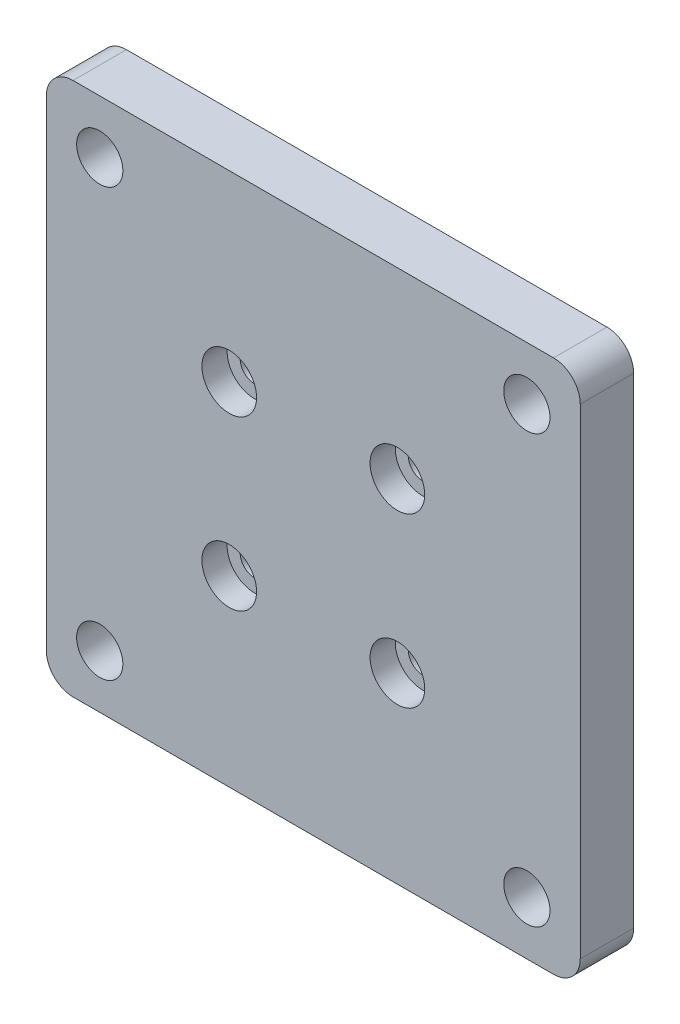
ISO-10303-21;
HEADER;
FILE_DESCRIPTION(('STEP AP214'),'2;1');
FILE_NAME('part.step','',(''),(''),'','','');
FILE_SCHEMA(('AUTOMOTIVE_DESIGN { 1 0 10303 214 1 1 1 1 }'));
ENDSEC;
DATA;
#1=APPLICATION_CONTEXT('core data for automotive mechanical design processes');
#2=APPLICATION_PROTOCOL_DEFINITION('international standard','automotive_design',2000,#1);
#3=PRODUCT_CONTEXT('',#1,'mechanical');
#4=PRODUCT('Part','Part','',(#3));
#5=PRODUCT_RELATED_PRODUCT_CATEGORY('part','',(#4));
#6=PRODUCT_DEFINITION_FORMATION('','',#4);
#7=PRODUCT_DEFINITION_CONTEXT('part definition',#1,'design');
#8=PRODUCT_DEFINITION('design','',#6,#7);
#9=PRODUCT_DEFINITION_SHAPE('','',#8);
#10=(LENGTH_UNIT() NAMED_UNIT(*) SI_UNIT(.MILLI.,.METRE.));
#11=(NAMED_UNIT(*) PLANE_ANGLE_UNIT() SI_UNIT($,.RADIAN.));
#12=(NAMED_UNIT(*) SI_UNIT($,.STERADIAN.) SOLID_ANGLE_UNIT());
#13=UNCERTAINTY_MEASURE_WITH_UNIT(LENGTH_MEASURE(1.E-05),#10,'distance_accuracy_value','');
#14=(GEOMETRIC_REPRESENTATION_CONTEXT(3) GLOBAL_UNCERTAINTY_ASSIGNED_CONTEXT((#13)) GLOBAL_UNIT_ASSIGNED_CONTEXT((#10,
#11,#12)) REPRESENTATION_CONTEXT('',''));
#15=CARTESIAN_POINT('',(0.,0.,0.));
#16=DIRECTION('',(0.,0.,1.));
#17=DIRECTION('',(1.,0.,0.));
#18=AXIS2_PLACEMENT_3D('',#15,#16,#17);
#19=CARTESIAN_POINT('',(-31.75,-31.75,3.175));
#20=DIRECTION('',(1.,0.,0.));
#21=DIRECTION('',(0.,0.,-1.));
#22=AXIS2_PLACEMENT_3D('',#19,#20,#21);
#23=PLANE('',#22);
#24=DIRECTION('',(0.,-1.,0.));
#25=VECTOR('',#24,1.);
#26=CARTESIAN_POINT('',(-31.75,-31.75,-3.175));
#27=LINE('',#26,#25);
#28=CARTESIAN_POINT('',(-31.75,28.575,-3.175));
#29=VERTEX_POINT('',#28);
#30=CARTESIAN_POINT('',(-31.75,-28.575,-3.175));
#31=VERTEX_POINT('',#30);
#32=EDGE_CURVE('E142',#29,#31,#27,.T.);
#33=ORIENTED_EDGE('',*,*,#32,.T.);
#34=DIRECTION('',(0.,0.,-1.));
#35=VECTOR('',#34,1.);
#36=CARTESIAN_POINT('',(-31.75,-28.575,3.175));
#37=LINE('',#36,#35);
#38=CARTESIAN_POINT('',(-31.75,-28.575,3.175));
#39=VERTEX_POINT('',#38);
#40=EDGE_CURVE('E165',#31,#39,#37,.F.);
#41=ORIENTED_EDGE('',*,*,#40,.T.);
#42=DIRECTION('',(0.,-1.,0.));
#43=VECTOR('',#42,1.);
#44=CARTESIAN_POINT('',(-31.75,-31.75,3.175));
#45=LINE('',#44,#43);
#46=CARTESIAN_POINT('',(-31.75,28.575,3.175));
#47=VERTEX_POINT('',#46);
#48=EDGE_CURVE('E140',#47,#39,#45,.T.);
#49=ORIENTED_EDGE('',*,*,#48,.F.);
#50=DIRECTION('',(0.,0.,-1.));
#51=VECTOR('',#50,1.);
#52=CARTESIAN_POINT('',(-31.75,28.575,3.175));
#53=LINE('',#52,#51);
#54=EDGE_CURVE('E162',#47,#29,#53,.T.);
#55=ORIENTED_EDGE('',*,*,#54,.T.);
#56=EDGE_LOOP('',(#33,#41,#49,#55));
#57=FACE_BOUND('',#56,.T.);
#58=ADVANCED_FACE('F47',(#57),#23,.F.);
#59=CARTESIAN_POINT('',(31.75,-31.75,3.175));
#60=DIRECTION('',(0.,1.,0.));
#61=DIRECTION('',(-1.,0.,0.));
#62=AXIS2_PLACEMENT_3D('',#59,#60,#61);
#63=PLANE('',#62);
#64=DIRECTION('',(1.,0.,0.));
#65=VECTOR('',#64,1.);
#66=CARTESIAN_POINT('',(31.75,-31.75,-3.175));
#67=LINE('',#66,#65);
#68=CARTESIAN_POINT('',(-28.575,-31.75,-3.175));
#69=VERTEX_POINT('',#68);
#70=CARTESIAN_POINT('',(28.575,-31.75,-3.175));
#71=VERTEX_POINT('',#70);
#72=EDGE_CURVE('E138',#69,#71,#67,.T.);
#73=ORIENTED_EDGE('',*,*,#72,.T.);
#74=DIRECTION('',(0.,0.,-1.));
#75=VECTOR('',#74,1.);
#76=CARTESIAN_POINT('',(28.575,-31.75,3.175));
#77=LINE('',#76,#75);
#78=CARTESIAN_POINT('',(28.575,-31.75,3.175));
#79=VERTEX_POINT('',#78);
#80=EDGE_CURVE('E117',#71,#79,#77,.F.);
#81=ORIENTED_EDGE('',*,*,#80,.T.);
#82=DIRECTION('',(1.,0.,0.));
#83=VECTOR('',#82,1.);
#84=CARTESIAN_POINT('',(31.75,-31.75,3.175));
#85=LINE('',#84,#83);
#86=CARTESIAN_POINT('',(-28.575,-31.75,3.175));
#87=VERTEX_POINT('',#86);
#88=EDGE_CURVE('E181',#87,#79,#85,.T.);
#89=ORIENTED_EDGE('',*,*,#88,.F.);
#90=DIRECTION('',(0.,0.,-1.));
#91=VECTOR('',#90,1.);
#92=CARTESIAN_POINT('',(-28.575,-31.75,3.175));
#93=LINE('',#92,#91);
#94=EDGE_CURVE('E122',#87,#69,#93,.T.);
#95=ORIENTED_EDGE('',*,*,#94,.T.);
#96=EDGE_LOOP('',(#73,#81,#89,#95));
#97=FACE_BOUND('',#96,.T.);
#98=ADVANCED_FACE('F287',(#97),#63,.F.);
#99=CARTESIAN_POINT('',(31.75,-31.75,3.175));
#100=DIRECTION('',(-1.,0.,0.));
#101=DIRECTION('',(0.,0.,1.));
#102=AXIS2_PLACEMENT_3D('',#99,#100,#101);
#103=PLANE('',#102);
#104=DIRECTION('',(0.,1.,0.));
#105=VECTOR('',#104,1.);
#106=CARTESIAN_POINT('',(31.75,-31.75,3.175));
#107=LINE('',#106,#105);
#108=CARTESIAN_POINT('',(31.75,-28.575,3.175));
#109=VERTEX_POINT('',#108);
#110=CARTESIAN_POINT('',(31.75,28.575,3.175));
#111=VERTEX_POINT('',#110);
#112=EDGE_CURVE('E131',#109,#111,#107,.T.);
#113=ORIENTED_EDGE('',*,*,#112,.F.);
#114=DIRECTION('',(0.,0.,-1.));
#115=VECTOR('',#114,1.);
#116=CARTESIAN_POINT('',(31.75,-28.575,3.175));
#117=LINE('',#116,#115);
#118=CARTESIAN_POINT('',(31.75,-28.575,-3.175));
#119=VERTEX_POINT('',#118);
#120=EDGE_CURVE('E116',#109,#119,#117,.T.);
#121=ORIENTED_EDGE('',*,*,#120,.T.);
#122=DIRECTION('',(0.,1.,0.));
#123=VECTOR('',#122,1.);
#124=CARTESIAN_POINT('',(31.75,-31.75,-3.175));
#125=LINE('',#124,#123);
#126=CARTESIAN_POINT('',(31.75,28.575,-3.175));
#127=VERTEX_POINT('',#126);
#128=EDGE_CURVE('E129',#119,#127,#125,.T.);
#129=ORIENTED_EDGE('',*,*,#128,.T.);
#130=DIRECTION('',(0.,0.,-1.));
#131=VECTOR('',#130,1.);
#132=CARTESIAN_POINT('',(31.75,28.575,3.175));
#133=LINE('',#132,#131);
#134=EDGE_CURVE('E133',#127,#111,#133,.F.);
#135=ORIENTED_EDGE('',*,*,#134,.T.);
#136=EDGE_LOOP('',(#113,#121,#129,#135));
#137=FACE_BOUND('',#136,.T.);
#138=ADVANCED_FACE('F128',(#137),#103,.F.);
#139=CARTESIAN_POINT('',(31.75,31.75,3.175));
#140=DIRECTION('',(0.,-1.,0.));
#141=DIRECTION('',(1.,0.,0.));
#142=AXIS2_PLACEMENT_3D('',#139,#140,#141);
#143=PLANE('',#142);
#144=DIRECTION('',(-1.,0.,0.));
#145=VECTOR('',#144,1.);
#146=CARTESIAN_POINT('',(31.75,31.75,-3.175));
#147=LINE('',#146,#145);
#148=CARTESIAN_POINT('',(28.575,31.75,-3.175));
#149=VERTEX_POINT('',#148);
#150=CARTESIAN_POINT('',(-28.575,31.75,-3.175));
#151=VERTEX_POINT('',#150);
#152=EDGE_CURVE('E137',#149,#151,#147,.T.);
#153=ORIENTED_EDGE('',*,*,#152,.T.);
#154=DIRECTION('',(0.,0.,-1.));
#155=VECTOR('',#154,1.);
#156=CARTESIAN_POINT('',(-28.575,31.75,3.175));
#157=LINE('',#156,#155);
#158=CARTESIAN_POINT('',(-28.575,31.75,3.175));
#159=VERTEX_POINT('',#158);
#160=EDGE_CURVE('E11',#151,#159,#157,.F.);
#161=ORIENTED_EDGE('',*,*,#160,.T.);
#162=DIRECTION('',(-1.,0.,0.));
#163=VECTOR('',#162,1.);
#164=CARTESIAN_POINT('',(31.75,31.75,3.175));
#165=LINE('',#164,#163);
#166=CARTESIAN_POINT('',(28.575,31.75,3.175));
#167=VERTEX_POINT('',#166);
#168=EDGE_CURVE('E146',#167,#159,#165,.T.);
#169=ORIENTED_EDGE('',*,*,#168,.F.);
#170=DIRECTION('',(0.,0.,-1.));
#171=VECTOR('',#170,1.);
#172=CARTESIAN_POINT('',(28.575,31.75,3.175));
#173=LINE('',#172,#171);
#174=EDGE_CURVE('E55',#167,#149,#173,.T.);
#175=ORIENTED_EDGE('',*,*,#174,.T.);
#176=EDGE_LOOP('',(#153,#161,#169,#175));
#177=FACE_BOUND('',#176,.T.);
#178=ADVANCED_FACE('F168',(#177),#143,.F.);
#179=CARTESIAN_POINT('',(0.,0.,3.175));
#180=DIRECTION('',(0.,0.,1.));
#181=DIRECTION('',(1.,0.,0.));
#182=AXIS2_PLACEMENT_3D('',#179,#180,#181);
#183=PLANE('',#182);
#184=CARTESIAN_POINT('',(-25.4,25.4,3.175));
#185=DIRECTION('',(0.,0.,1.));
#186=DIRECTION('',(1.,0.,0.));
#187=AXIS2_PLACEMENT_3D('',#184,#185,#186);
#188=CIRCLE('',#187,2.75);
#189=CARTESIAN_POINT('',(-22.65,25.4,3.175));
#190=VERTEX_POINT('',#189);
#191=EDGE_CURVE('E261',#190,#190,#188,.T.);
#192=ORIENTED_EDGE('',*,*,#191,.F.);
#193=EDGE_LOOP('',(#192));
#194=FACE_BOUND('',#193,.T.);
#195=CARTESIAN_POINT('',(25.4,-25.4,3.175));
#196=DIRECTION('',(0.,0.,1.));
#197=DIRECTION('',(1.,0.,0.));
#198=AXIS2_PLACEMENT_3D('',#195,#196,#197);
#199=CIRCLE('',#198,2.75);
#200=CARTESIAN_POINT('',(28.15,-25.4,3.175));
#201=VERTEX_POINT('',#200);
#202=EDGE_CURVE('E255',#201,#201,#199,.T.);
#203=ORIENTED_EDGE('',*,*,#202,.F.);
#204=EDGE_LOOP('',(#203));
#205=FACE_BOUND('',#204,.T.);
#206=CARTESIAN_POINT('',(25.4,25.4,3.175));
#207=DIRECTION('',(0.,0.,1.));
#208=DIRECTION('',(1.,0.,0.));
#209=AXIS2_PLACEMENT_3D('',#206,#207,#208);
#210=CIRCLE('',#209,2.75);
#211=CARTESIAN_POINT('',(28.15,25.4,3.175));
#212=VERTEX_POINT('',#211);
#213=EDGE_CURVE('E249',#212,#212,#210,.T.);
#214=ORIENTED_EDGE('',*,*,#213,.F.);
#215=EDGE_LOOP('',(#214));
#216=FACE_BOUND('',#215,.T.);
#217=CARTESIAN_POINT('',(-25.4,-25.4,3.175));
#218=DIRECTION('',(0.,0.,1.));
#219=DIRECTION('',(1.,0.,0.));
#220=AXIS2_PLACEMENT_3D('',#217,#218,#219);
#221=CIRCLE('',#220,2.75);
#222=CARTESIAN_POINT('',(-22.65,-25.4,3.175));
#223=VERTEX_POINT('',#222);
#224=EDGE_CURVE('E243',#223,#223,#221,.T.);
#225=ORIENTED_EDGE('',*,*,#224,.F.);
#226=EDGE_LOOP('',(#225));
#227=FACE_BOUND('',#226,.T.);
#228=CARTESIAN_POINT('',(-10.,10.,3.175));
#229=DIRECTION('',(0.,0.,1.));
#230=DIRECTION('',(1.,0.,0.));
#231=AXIS2_PLACEMENT_3D('',#228,#229,#230);
#232=CIRCLE('',#231,3.25);
#233=CARTESIAN_POINT('',(-6.75,10.,3.175));
#234=VERTEX_POINT('',#233);
#235=EDGE_CURVE('E237',#234,#234,#232,.T.);
#236=ORIENTED_EDGE('',*,*,#235,.F.);
#237=EDGE_LOOP('',(#236));
#238=FACE_BOUND('',#237,.T.);
#239=CARTESIAN_POINT('',(10.,10.,3.175));
#240=DIRECTION('',(0.,0.,1.));
#241=DIRECTION('',(1.,0.,0.));
#242=AXIS2_PLACEMENT_3D('',#239,#240,#241);
#243=CIRCLE('',#242,3.25);
#244=CARTESIAN_POINT('',(13.25,10.,3.175));
#245=VERTEX_POINT('',#244);
#246=EDGE_CURVE('E225',#245,#245,#243,.T.);
#247=ORIENTED_EDGE('',*,*,#246,.F.);
#248=EDGE_LOOP('',(#247));
#249=FACE_BOUND('',#248,.T.);
#250=CARTESIAN_POINT('',(10.,-10.,3.175));
#251=DIRECTION('',(0.,0.,1.));
#252=DIRECTION('',(1.,0.,0.));
#253=AXIS2_PLACEMENT_3D('',#250,#251,#252);
#254=CIRCLE('',#253,3.25);
#255=CARTESIAN_POINT('',(13.25,-10.,3.175));
#256=VERTEX_POINT('',#255);
#257=EDGE_CURVE('E213',#256,#256,#254,.T.);
#258=ORIENTED_EDGE('',*,*,#257,.F.);
#259=EDGE_LOOP('',(#258));
#260=FACE_BOUND('',#259,.T.);
#261=CARTESIAN_POINT('',(-10.,-10.,3.175));
#262=DIRECTION('',(0.,0.,1.));
#263=DIRECTION('',(1.,0.,0.));
#264=AXIS2_PLACEMENT_3D('',#261,#262,#263);
#265=CIRCLE('',#264,3.25);
#266=CARTESIAN_POINT('',(-6.75,-10.,3.175));
#267=VERTEX_POINT('',#266);
#268=EDGE_CURVE('E199',#267,#267,#265,.T.);
#269=ORIENTED_EDGE('',*,*,#268,.F.);
#270=EDGE_LOOP('',(#269));
#271=FACE_BOUND('',#270,.T.);
#272=ORIENTED_EDGE('',*,*,#88,.T.);
#273=CARTESIAN_POINT('',(28.575,-28.575,3.175));
#274=DIRECTION('',(0.,0.,1.));
#275=DIRECTION('',(1.,0.,0.));
#276=AXIS2_PLACEMENT_3D('',#273,#274,#275);
#277=CIRCLE('',#276,3.175);
#278=EDGE_CURVE('E160',#79,#109,#277,.T.);
#279=ORIENTED_EDGE('',*,*,#278,.T.);
#280=ORIENTED_EDGE('',*,*,#112,.T.);
#281=CARTESIAN_POINT('',(28.575,28.575,3.175));
#282=DIRECTION('',(0.,0.,1.));
#283=DIRECTION('',(1.,0.,0.));
#284=AXIS2_PLACEMENT_3D('',#281,#282,#283);
#285=CIRCLE('',#284,3.175);
#286=EDGE_CURVE('E67',#111,#167,#285,.T.);
#287=ORIENTED_EDGE('',*,*,#286,.T.);
#288=ORIENTED_EDGE('',*,*,#168,.T.);
#289=CARTESIAN_POINT('',(-28.575,28.575,3.175));
#290=DIRECTION('',(0.,0.,1.));
#291=DIRECTION('',(1.,0.,0.));
#292=AXIS2_PLACEMENT_3D('',#289,#290,#291);
#293=CIRCLE('',#292,3.175);
#294=EDGE_CURVE('E156',#159,#47,#293,.T.);
#295=ORIENTED_EDGE('',*,*,#294,.T.);
#296=ORIENTED_EDGE('',*,*,#48,.T.);
#297=CARTESIAN_POINT('',(-28.575,-28.575,3.175));
#298=DIRECTION('',(0.,0.,1.));
#299=DIRECTION('',(1.,0.,0.));
#300=AXIS2_PLACEMENT_3D('',#297,#298,#299);
#301=CIRCLE('',#300,3.175);
#302=EDGE_CURVE('E158',#39,#87,#301,.T.);
#303=ORIENTED_EDGE('',*,*,#302,.T.);
#304=EDGE_LOOP('',(#272,#279,#280,#287,#288,#295,#296,#303));
#305=FACE_BOUND('',#304,.T.);
#306=ADVANCED_FACE('F267',(#194,#205,#216,#227,#238,#249,#260,#271,#305),#183,.T.);
#307=CARTESIAN_POINT('',(0.,0.,-3.175));
#308=DIRECTION('',(0.,0.,1.));
#309=DIRECTION('',(1.,0.,0.));
#310=AXIS2_PLACEMENT_3D('',#307,#308,#309);
#311=PLANE('',#310);
#312=CARTESIAN_POINT('',(-25.4,25.4,-3.175));
#313=DIRECTION('',(0.,0.,1.));
#314=DIRECTION('',(1.,0.,0.));
#315=AXIS2_PLACEMENT_3D('',#312,#313,#314);
#316=CIRCLE('',#315,2.75);
#317=CARTESIAN_POINT('',(-22.65,25.4,-3.175));
#318=VERTEX_POINT('',#317);
#319=EDGE_CURVE('E258',#318,#318,#316,.T.);
#320=ORIENTED_EDGE('',*,*,#319,.T.);
#321=EDGE_LOOP('',(#320));
#322=FACE_BOUND('',#321,.T.);
#323=CARTESIAN_POINT('',(25.4,-25.4,-3.175));
#324=DIRECTION('',(0.,0.,1.));
#325=DIRECTION('',(1.,0.,0.));
#326=AXIS2_PLACEMENT_3D('',#323,#324,#325);
#327=CIRCLE('',#326,2.75);
#328=CARTESIAN_POINT('',(28.15,-25.4,-3.175));
#329=VERTEX_POINT('',#328);
#330=EDGE_CURVE('E252',#329,#329,#327,.T.);
#331=ORIENTED_EDGE('',*,*,#330,.T.);
#332=EDGE_LOOP('',(#331));
#333=FACE_BOUND('',#332,.T.);
#334=CARTESIAN_POINT('',(25.4,25.4,-3.175));
#335=DIRECTION('',(0.,0.,1.));
#336=DIRECTION('',(1.,0.,0.));
#337=AXIS2_PLACEMENT_3D('',#334,#335,#336);
#338=CIRCLE('',#337,2.75);
#339=CARTESIAN_POINT('',(28.15,25.4,-3.175));
#340=VERTEX_POINT('',#339);
#341=EDGE_CURVE('E246',#340,#340,#338,.T.);
#342=ORIENTED_EDGE('',*,*,#341,.T.);
#343=EDGE_LOOP('',(#342));
#344=FACE_BOUND('',#343,.T.);
#345=CARTESIAN_POINT('',(-25.4,-25.4,-3.175));
#346=DIRECTION('',(0.,0.,1.));
#347=DIRECTION('',(1.,0.,0.));
#348=AXIS2_PLACEMENT_3D('',#345,#346,#347);
#349=CIRCLE('',#348,2.75);
#350=CARTESIAN_POINT('',(-22.65,-25.4,-3.175));
#351=VERTEX_POINT('',#350);
#352=EDGE_CURVE('E240',#351,#351,#349,.T.);
#353=ORIENTED_EDGE('',*,*,#352,.T.);
#354=EDGE_LOOP('',(#353));
#355=FACE_BOUND('',#354,.T.);
#356=CARTESIAN_POINT('',(-10.,10.,-3.175));
#357=DIRECTION('',(0.,0.,1.));
#358=DIRECTION('',(1.,0.,0.));
#359=AXIS2_PLACEMENT_3D('',#356,#357,#358);
#360=CIRCLE('',#359,1.7);
#361=CARTESIAN_POINT('',(-8.3,10.,-3.175));
#362=VERTEX_POINT('',#361);
#363=EDGE_CURVE('E228',#362,#362,#360,.T.);
#364=ORIENTED_EDGE('',*,*,#363,.T.);
#365=EDGE_LOOP('',(#364));
#366=FACE_BOUND('',#365,.T.);
#367=CARTESIAN_POINT('',(10.,10.,-3.175));
#368=DIRECTION('',(0.,0.,1.));
#369=DIRECTION('',(1.,0.,0.));
#370=AXIS2_PLACEMENT_3D('',#367,#368,#369);
#371=CIRCLE('',#370,1.7);
#372=CARTESIAN_POINT('',(11.7,10.,-3.175));
#373=VERTEX_POINT('',#372);
#374=EDGE_CURVE('E216',#373,#373,#371,.T.);
#375=ORIENTED_EDGE('',*,*,#374,.T.);
#376=EDGE_LOOP('',(#375));
#377=FACE_BOUND('',#376,.T.);
#378=CARTESIAN_POINT('',(10.,-10.,-3.175));
#379=DIRECTION('',(0.,0.,1.));
#380=DIRECTION('',(1.,0.,0.));
#381=AXIS2_PLACEMENT_3D('',#378,#379,#380);
#382=CIRCLE('',#381,1.7);
#383=CARTESIAN_POINT('',(11.7,-10.,-3.175));
#384=VERTEX_POINT('',#383);
#385=EDGE_CURVE('E204',#384,#384,#382,.T.);
#386=ORIENTED_EDGE('',*,*,#385,.T.);
#387=EDGE_LOOP('',(#386));
#388=FACE_BOUND('',#387,.T.);
#389=CARTESIAN_POINT('',(-10.,-10.,-3.175));
#390=DIRECTION('',(0.,0.,1.));
#391=DIRECTION('',(1.,0.,0.));
#392=AXIS2_PLACEMENT_3D('',#389,#390,#391);
#393=CIRCLE('',#392,1.7);
#394=CARTESIAN_POINT('',(-8.3,-10.,-3.175));
#395=VERTEX_POINT('',#394);
#396=EDGE_CURVE('E186',#395,#395,#393,.T.);
#397=ORIENTED_EDGE('',*,*,#396,.T.);
#398=EDGE_LOOP('',(#397));
#399=FACE_BOUND('',#398,.T.);
#400=ORIENTED_EDGE('',*,*,#128,.F.);
#401=CARTESIAN_POINT('',(28.575,-28.575,-3.175));
#402=DIRECTION('',(0.,0.,1.));
#403=DIRECTION('',(1.,0.,0.));
#404=AXIS2_PLACEMENT_3D('',#401,#402,#403);
#405=CIRCLE('',#404,3.175);
#406=EDGE_CURVE('E112',#119,#71,#405,.F.);
#407=ORIENTED_EDGE('',*,*,#406,.T.);
#408=ORIENTED_EDGE('',*,*,#72,.F.);
#409=CARTESIAN_POINT('',(-28.575,-28.575,-3.175));
#410=DIRECTION('',(0.,0.,1.));
#411=DIRECTION('',(1.,0.,0.));
#412=AXIS2_PLACEMENT_3D('',#409,#410,#411);
#413=CIRCLE('',#412,3.175);
#414=EDGE_CURVE('E123',#69,#31,#413,.F.);
#415=ORIENTED_EDGE('',*,*,#414,.T.);
#416=ORIENTED_EDGE('',*,*,#32,.F.);
#417=CARTESIAN_POINT('',(-28.575,28.575,-3.175));
#418=DIRECTION('',(0.,0.,1.));
#419=DIRECTION('',(1.,0.,0.));
#420=AXIS2_PLACEMENT_3D('',#417,#418,#419);
#421=CIRCLE('',#420,3.175);
#422=EDGE_CURVE('E149',#29,#151,#421,.F.);
#423=ORIENTED_EDGE('',*,*,#422,.T.);
#424=ORIENTED_EDGE('',*,*,#152,.F.);
#425=CARTESIAN_POINT('',(28.575,28.575,-3.175));
#426=DIRECTION('',(0.,0.,1.));
#427=DIRECTION('',(1.,0.,0.));
#428=AXIS2_PLACEMENT_3D('',#425,#426,#427);
#429=CIRCLE('',#428,3.175);
#430=EDGE_CURVE('E132',#149,#127,#429,.F.);
#431=ORIENTED_EDGE('',*,*,#430,.T.);
#432=EDGE_LOOP('',(#400,#407,#408,#415,#416,#423,#424,#431));
#433=FACE_BOUND('',#432,.T.);
#434=ADVANCED_FACE('F135',(#322,#333,#344,#355,#366,#377,#388,#399,#433),#311,.F.);
#435=CARTESIAN_POINT('',(-10.,-10.,3.175));
#436=DIRECTION('',(0.,0.,1.));
#437=DIRECTION('',(1.,0.,0.));
#438=AXIS2_PLACEMENT_3D('',#435,#436,#437);
#439=CYLINDRICAL_SURFACE('',#438,1.7);
#440=ORIENTED_EDGE('',*,*,#396,.F.);
#441=EDGE_LOOP('',(#440));
#442=FACE_BOUND('',#441,.T.);
#443=CARTESIAN_POINT('',(-10.,-10.,0.175));
#444=DIRECTION('',(0.,0.,1.));
#445=DIRECTION('',(1.,0.,0.));
#446=AXIS2_PLACEMENT_3D('',#443,#444,#445);
#447=CIRCLE('',#446,1.7);
#448=CARTESIAN_POINT('',(-8.3,-10.,0.175));
#449=VERTEX_POINT('',#448);
#450=EDGE_CURVE('E191',#449,#449,#447,.T.);
#451=ORIENTED_EDGE('',*,*,#450,.T.);
#452=EDGE_LOOP('',(#451));
#453=FACE_BOUND('',#452,.T.);
#454=ADVANCED_FACE('F310',(#442,#453),#439,.F.);
#455=CARTESIAN_POINT('',(-8.3,-10.,0.175));
#456=DIRECTION('',(0.,0.,-1.));
#457=DIRECTION('',(-1.,0.,0.));
#458=AXIS2_PLACEMENT_3D('',#455,#456,#457);
#459=PLANE('',#458);
#460=ORIENTED_EDGE('',*,*,#450,.F.);
#461=EDGE_LOOP('',(#460));
#462=FACE_BOUND('',#461,.T.);
#463=CARTESIAN_POINT('',(-10.,-10.,0.175));
#464=DIRECTION('',(0.,0.,1.));
#465=DIRECTION('',(1.,0.,0.));
#466=AXIS2_PLACEMENT_3D('',#463,#464,#465);
#467=CIRCLE('',#466,3.25);
#468=CARTESIAN_POINT('',(-6.75,-10.,0.175));
#469=VERTEX_POINT('',#468);
#470=EDGE_CURVE('E195',#469,#469,#467,.T.);
#471=ORIENTED_EDGE('',*,*,#470,.T.);
#472=EDGE_LOOP('',(#471));
#473=FACE_BOUND('',#472,.T.);
#474=ADVANCED_FACE('F315',(#462,#473),#459,.F.);
#475=CARTESIAN_POINT('',(-10.,-10.,3.175));
#476=DIRECTION('',(0.,0.,1.));
#477=DIRECTION('',(1.,0.,0.));
#478=AXIS2_PLACEMENT_3D('',#475,#476,#477);
#479=CYLINDRICAL_SURFACE('',#478,3.25);
#480=ORIENTED_EDGE('',*,*,#470,.F.);
#481=EDGE_LOOP('',(#480));
#482=FACE_BOUND('',#481,.T.);
#483=ORIENTED_EDGE('',*,*,#268,.T.);
#484=EDGE_LOOP('',(#483));
#485=FACE_BOUND('',#484,.T.);
#486=ADVANCED_FACE('F319',(#482,#485),#479,.F.);
#487=CARTESIAN_POINT('',(10.,-10.,3.175));
#488=DIRECTION('',(0.,0.,1.));
#489=DIRECTION('',(1.,0.,0.));
#490=AXIS2_PLACEMENT_3D('',#487,#488,#489);
#491=CYLINDRICAL_SURFACE('',#490,1.7);
#492=ORIENTED_EDGE('',*,*,#385,.F.);
#493=EDGE_LOOP('',(#492));
#494=FACE_BOUND('',#493,.T.);
#495=CARTESIAN_POINT('',(10.,-10.,0.175));
#496=DIRECTION('',(0.,0.,1.));
#497=DIRECTION('',(1.,0.,0.));
#498=AXIS2_PLACEMENT_3D('',#495,#496,#497);
#499=CIRCLE('',#498,1.7);
#500=CARTESIAN_POINT('',(11.7,-10.,0.175));
#501=VERTEX_POINT('',#500);
#502=EDGE_CURVE('E207',#501,#501,#499,.T.);
#503=ORIENTED_EDGE('',*,*,#502,.T.);
#504=EDGE_LOOP('',(#503));
#505=FACE_BOUND('',#504,.T.);
#506=ADVANCED_FACE('F323',(#494,#505),#491,.F.);
#507=CARTESIAN_POINT('',(11.7,-10.,0.175));
#508=DIRECTION('',(0.,0.,-1.));
#509=DIRECTION('',(-1.,0.,0.));
#510=AXIS2_PLACEMENT_3D('',#507,#508,#509);
#511=PLANE('',#510);
#512=ORIENTED_EDGE('',*,*,#502,.F.);
#513=EDGE_LOOP('',(#512));
#514=FACE_BOUND('',#513,.T.);
#515=CARTESIAN_POINT('',(10.,-10.,0.175));
#516=DIRECTION('',(0.,0.,1.));
#517=DIRECTION('',(1.,0.,0.));
#518=AXIS2_PLACEMENT_3D('',#515,#516,#517);
#519=CIRCLE('',#518,3.25);
#520=CARTESIAN_POINT('',(13.25,-10.,0.175));
#521=VERTEX_POINT('',#520);
#522=EDGE_CURVE('E210',#521,#521,#519,.T.);
#523=ORIENTED_EDGE('',*,*,#522,.T.);
#524=EDGE_LOOP('',(#523));
#525=FACE_BOUND('',#524,.T.);
#526=ADVANCED_FACE('F327',(#514,#525),#511,.F.);
#527=CARTESIAN_POINT('',(10.,-10.,3.175));
#528=DIRECTION('',(0.,0.,1.));
#529=DIRECTION('',(1.,0.,0.));
#530=AXIS2_PLACEMENT_3D('',#527,#528,#529);
#531=CYLINDRICAL_SURFACE('',#530,3.25);
#532=ORIENTED_EDGE('',*,*,#522,.F.);
#533=EDGE_LOOP('',(#532));
#534=FACE_BOUND('',#533,.T.);
#535=ORIENTED_EDGE('',*,*,#257,.T.);
#536=EDGE_LOOP('',(#535));
#537=FACE_BOUND('',#536,.T.);
#538=ADVANCED_FACE('F331',(#534,#537),#531,.F.);
#539=CARTESIAN_POINT('',(10.,10.,3.175));
#540=DIRECTION('',(0.,0.,1.));
#541=DIRECTION('',(1.,0.,0.));
#542=AXIS2_PLACEMENT_3D('',#539,#540,#541);
#543=CYLINDRICAL_SURFACE('',#542,1.7);
#544=ORIENTED_EDGE('',*,*,#374,.F.);
#545=EDGE_LOOP('',(#544));
#546=FACE_BOUND('',#545,.T.);
#547=CARTESIAN_POINT('',(10.,10.,0.175));
#548=DIRECTION('',(0.,0.,1.));
#549=DIRECTION('',(1.,0.,0.));
#550=AXIS2_PLACEMENT_3D('',#547,#548,#549);
#551=CIRCLE('',#550,1.7);
#552=CARTESIAN_POINT('',(11.7,10.,0.175));
#553=VERTEX_POINT('',#552);
#554=EDGE_CURVE('E219',#553,#553,#551,.T.);
#555=ORIENTED_EDGE('',*,*,#554,.T.);
#556=EDGE_LOOP('',(#555));
#557=FACE_BOUND('',#556,.T.);
#558=ADVANCED_FACE('F335',(#546,#557),#543,.F.);
#559=CARTESIAN_POINT('',(11.7,10.,0.175));
#560=DIRECTION('',(0.,0.,-1.));
#561=DIRECTION('',(-1.,0.,0.));
#562=AXIS2_PLACEMENT_3D('',#559,#560,#561);
#563=PLANE('',#562);
#564=ORIENTED_EDGE('',*,*,#554,.F.);
#565=EDGE_LOOP('',(#564));
#566=FACE_BOUND('',#565,.T.);
#567=CARTESIAN_POINT('',(10.,10.,0.175));
#568=DIRECTION('',(0.,0.,1.));
#569=DIRECTION('',(1.,0.,0.));
#570=AXIS2_PLACEMENT_3D('',#567,#568,#569);
#571=CIRCLE('',#570,3.25);
#572=CARTESIAN_POINT('',(13.25,10.,0.175));
#573=VERTEX_POINT('',#572);
#574=EDGE_CURVE('E222',#573,#573,#571,.T.);
#575=ORIENTED_EDGE('',*,*,#574,.T.);
#576=EDGE_LOOP('',(#575));
#577=FACE_BOUND('',#576,.T.);
#578=ADVANCED_FACE('F339',(#566,#577),#563,.F.);
#579=CARTESIAN_POINT('',(10.,10.,3.175));
#580=DIRECTION('',(0.,0.,1.));
#581=DIRECTION('',(1.,0.,0.));
#582=AXIS2_PLACEMENT_3D('',#579,#580,#581);
#583=CYLINDRICAL_SURFACE('',#582,3.25);
#584=ORIENTED_EDGE('',*,*,#574,.F.);
#585=EDGE_LOOP('',(#584));
#586=FACE_BOUND('',#585,.T.);
#587=ORIENTED_EDGE('',*,*,#246,.T.);
#588=EDGE_LOOP('',(#587));
#589=FACE_BOUND('',#588,.T.);
#590=ADVANCED_FACE('F343',(#586,#589),#583,.F.);
#591=CARTESIAN_POINT('',(-10.,10.,3.175));
#592=DIRECTION('',(0.,0.,1.));
#593=DIRECTION('',(1.,0.,0.));
#594=AXIS2_PLACEMENT_3D('',#591,#592,#593);
#595=CYLINDRICAL_SURFACE('',#594,1.7);
#596=ORIENTED_EDGE('',*,*,#363,.F.);
#597=EDGE_LOOP('',(#596));
#598=FACE_BOUND('',#597,.T.);
#599=CARTESIAN_POINT('',(-10.,10.,0.175));
#600=DIRECTION('',(0.,0.,1.));
#601=DIRECTION('',(1.,0.,0.));
#602=AXIS2_PLACEMENT_3D('',#599,#600,#601);
#603=CIRCLE('',#602,1.7);
#604=CARTESIAN_POINT('',(-8.3,10.,0.175));
#605=VERTEX_POINT('',#604);
#606=EDGE_CURVE('E231',#605,#605,#603,.T.);
#607=ORIENTED_EDGE('',*,*,#606,.T.);
#608=EDGE_LOOP('',(#607));
#609=FACE_BOUND('',#608,.T.);
#610=ADVANCED_FACE('F347',(#598,#609),#595,.F.);
#611=CARTESIAN_POINT('',(-8.3,10.,0.175));
#612=DIRECTION('',(0.,0.,-1.));
#613=DIRECTION('',(-1.,0.,0.));
#614=AXIS2_PLACEMENT_3D('',#611,#612,#613);
#615=PLANE('',#614);
#616=ORIENTED_EDGE('',*,*,#606,.F.);
#617=EDGE_LOOP('',(#616));
#618=FACE_BOUND('',#617,.T.);
#619=CARTESIAN_POINT('',(-10.,10.,0.175));
#620=DIRECTION('',(0.,0.,1.));
#621=DIRECTION('',(1.,0.,0.));
#622=AXIS2_PLACEMENT_3D('',#619,#620,#621);
#623=CIRCLE('',#622,3.25);
#624=CARTESIAN_POINT('',(-6.75,10.,0.175));
#625=VERTEX_POINT('',#624);
#626=EDGE_CURVE('E234',#625,#625,#623,.T.);
#627=ORIENTED_EDGE('',*,*,#626,.T.);
#628=EDGE_LOOP('',(#627));
#629=FACE_BOUND('',#628,.T.);
#630=ADVANCED_FACE('F351',(#618,#629),#615,.F.);
#631=CARTESIAN_POINT('',(-10.,10.,3.175));
#632=DIRECTION('',(0.,0.,1.));
#633=DIRECTION('',(1.,0.,0.));
#634=AXIS2_PLACEMENT_3D('',#631,#632,#633);
#635=CYLINDRICAL_SURFACE('',#634,3.25);
#636=ORIENTED_EDGE('',*,*,#626,.F.);
#637=EDGE_LOOP('',(#636));
#638=FACE_BOUND('',#637,.T.);
#639=ORIENTED_EDGE('',*,*,#235,.T.);
#640=EDGE_LOOP('',(#639));
#641=FACE_BOUND('',#640,.T.);
#642=ADVANCED_FACE('F355',(#638,#641),#635,.F.);
#643=CARTESIAN_POINT('',(-25.4,-25.4,3.175));
#644=DIRECTION('',(0.,0.,1.));
#645=DIRECTION('',(1.,0.,0.));
#646=AXIS2_PLACEMENT_3D('',#643,#644,#645);
#647=CYLINDRICAL_SURFACE('',#646,2.75);
#648=ORIENTED_EDGE('',*,*,#352,.F.);
#649=EDGE_LOOP('',(#648));
#650=FACE_BOUND('',#649,.T.);
#651=ORIENTED_EDGE('',*,*,#224,.T.);
#652=EDGE_LOOP('',(#651));
#653=FACE_BOUND('',#652,.T.);
#654=ADVANCED_FACE('F359',(#650,#653),#647,.F.);
#655=CARTESIAN_POINT('',(25.4,25.4,3.175));
#656=DIRECTION('',(0.,0.,1.));
#657=DIRECTION('',(1.,0.,0.));
#658=AXIS2_PLACEMENT_3D('',#655,#656,#657);
#659=CYLINDRICAL_SURFACE('',#658,2.75);
#660=ORIENTED_EDGE('',*,*,#341,.F.);
#661=EDGE_LOOP('',(#660));
#662=FACE_BOUND('',#661,.T.);
#663=ORIENTED_EDGE('',*,*,#213,.T.);
#664=EDGE_LOOP('',(#663));
#665=FACE_BOUND('',#664,.T.);
#666=ADVANCED_FACE('F363',(#662,#665),#659,.F.);
#667=CARTESIAN_POINT('',(25.4,-25.4,3.175));
#668=DIRECTION('',(0.,0.,1.));
#669=DIRECTION('',(1.,0.,0.));
#670=AXIS2_PLACEMENT_3D('',#667,#668,#669);
#671=CYLINDRICAL_SURFACE('',#670,2.75);
#672=ORIENTED_EDGE('',*,*,#330,.F.);
#673=EDGE_LOOP('',(#672));
#674=FACE_BOUND('',#673,.T.);
#675=ORIENTED_EDGE('',*,*,#202,.T.);
#676=EDGE_LOOP('',(#675));
#677=FACE_BOUND('',#676,.T.);
#678=ADVANCED_FACE('F367',(#674,#677),#671,.F.);
#679=CARTESIAN_POINT('',(-25.4,25.4,3.175));
#680=DIRECTION('',(0.,0.,1.));
#681=DIRECTION('',(1.,0.,0.));
#682=AXIS2_PLACEMENT_3D('',#679,#680,#681);
#683=CYLINDRICAL_SURFACE('',#682,2.75);
#684=ORIENTED_EDGE('',*,*,#319,.F.);
#685=EDGE_LOOP('',(#684));
#686=FACE_BOUND('',#685,.T.);
#687=ORIENTED_EDGE('',*,*,#191,.T.);
#688=EDGE_LOOP('',(#687));
#689=FACE_BOUND('',#688,.T.);
#690=ADVANCED_FACE('F265',(#686,#689),#683,.F.);
#691=CARTESIAN_POINT('',(28.575,-28.575,3.175));
#692=DIRECTION('',(0.,0.,-1.));
#693=DIRECTION('',(-1.,0.,0.));
#694=AXIS2_PLACEMENT_3D('',#691,#692,#693);
#695=CYLINDRICAL_SURFACE('',#694,3.175);
#696=ORIENTED_EDGE('',*,*,#278,.F.);
#697=ORIENTED_EDGE('',*,*,#80,.F.);
#698=ORIENTED_EDGE('',*,*,#406,.F.);
#699=ORIENTED_EDGE('',*,*,#120,.F.);
#700=EDGE_LOOP('',(#696,#697,#698,#699));
#701=FACE_BOUND('',#700,.T.);
#702=ADVANCED_FACE('F115',(#701),#695,.T.);
#703=CARTESIAN_POINT('',(-28.575,-28.575,3.175));
#704=DIRECTION('',(0.,0.,-1.));
#705=DIRECTION('',(-1.,0.,0.));
#706=AXIS2_PLACEMENT_3D('',#703,#704,#705);
#707=CYLINDRICAL_SURFACE('',#706,3.175);
#708=ORIENTED_EDGE('',*,*,#302,.F.);
#709=ORIENTED_EDGE('',*,*,#40,.F.);
#710=ORIENTED_EDGE('',*,*,#414,.F.);
#711=ORIENTED_EDGE('',*,*,#94,.F.);
#712=EDGE_LOOP('',(#708,#709,#710,#711));
#713=FACE_BOUND('',#712,.T.);
#714=ADVANCED_FACE('F289',(#713),#707,.T.);
#715=CARTESIAN_POINT('',(-28.575,28.575,3.175));
#716=DIRECTION('',(0.,0.,-1.));
#717=DIRECTION('',(-1.,0.,0.));
#718=AXIS2_PLACEMENT_3D('',#715,#716,#717);
#719=CYLINDRICAL_SURFACE('',#718,3.175);
#720=ORIENTED_EDGE('',*,*,#294,.F.);
#721=ORIENTED_EDGE('',*,*,#160,.F.);
#722=ORIENTED_EDGE('',*,*,#422,.F.);
#723=ORIENTED_EDGE('',*,*,#54,.F.);
#724=EDGE_LOOP('',(#720,#721,#722,#723));
#725=FACE_BOUND('',#724,.T.);
#726=ADVANCED_FACE('F175',(#725),#719,.T.);
#727=CARTESIAN_POINT('',(28.575,28.575,3.175));
#728=DIRECTION('',(0.,0.,-1.));
#729=DIRECTION('',(-1.,0.,0.));
#730=AXIS2_PLACEMENT_3D('',#727,#728,#729);
#731=CYLINDRICAL_SURFACE('',#730,3.175);
#732=ORIENTED_EDGE('',*,*,#286,.F.);
#733=ORIENTED_EDGE('',*,*,#134,.F.);
#734=ORIENTED_EDGE('',*,*,#430,.F.);
#735=ORIENTED_EDGE('',*,*,#174,.F.);
#736=EDGE_LOOP('',(#732,#733,#734,#735));
#737=FACE_BOUND('',#736,.T.);
#738=ADVANCED_FACE('F49',(#737),#731,.T.);
#739=CLOSED_SHELL('',(#58,#98,#138,#178,#306,#434,#454,#474,#486,#506,#526,#538,#558,#578,#590,
#610,#630,#642,#654,#666,#678,#690,#702,#714,#726,#738));
#740=MANIFOLD_SOLID_BREP('B2',#739);
#741=ADVANCED_BREP_SHAPE_REPRESENTATION('',(#18,#740),#14);
#742=SHAPE_DEFINITION_REPRESENTATION(#9,#741);
ENDSEC;
END-ISO-10303-21;
